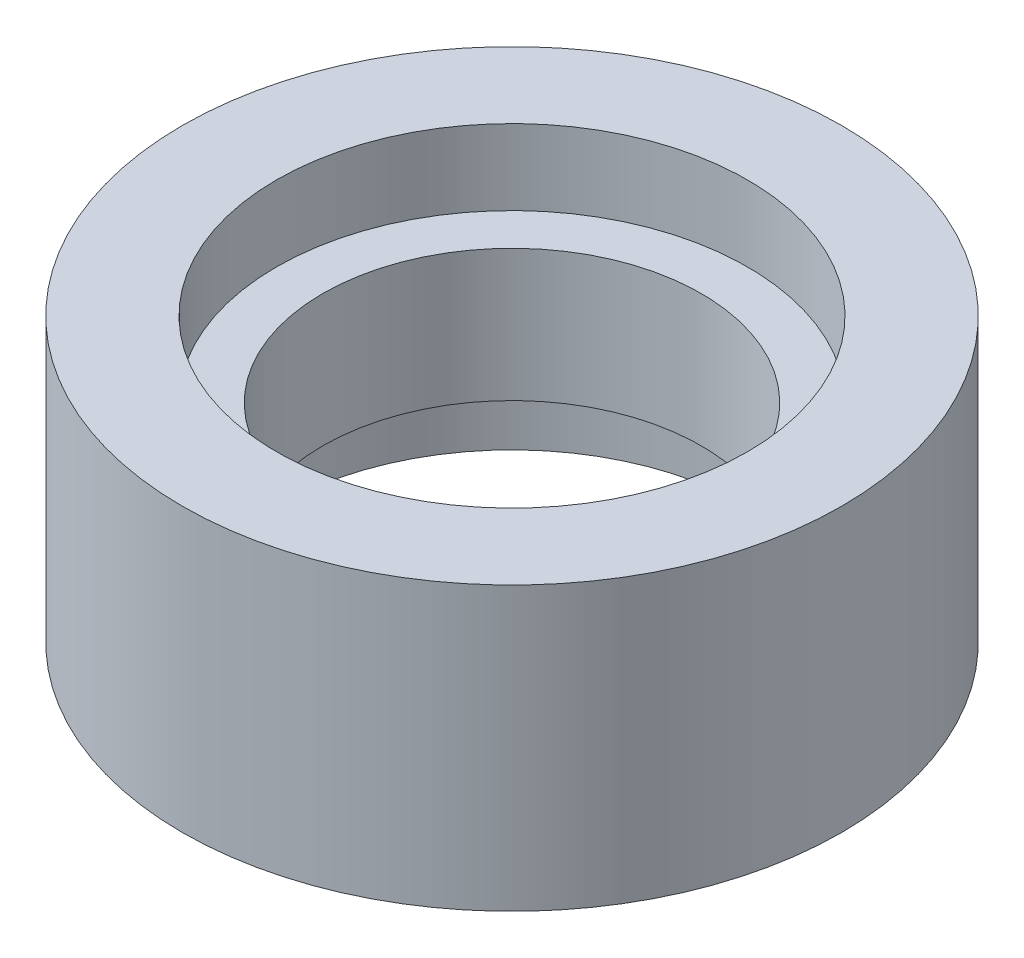
ISO-10303-21;
HEADER;
FILE_DESCRIPTION(('STEP AP214'),'2;1');
FILE_NAME('part.step','',(''),(''),'','','');
FILE_SCHEMA(('AUTOMOTIVE_DESIGN { 1 0 10303 214 1 1 1 1 }'));
ENDSEC;
DATA;
#1=APPLICATION_CONTEXT('core data for automotive mechanical design processes');
#2=APPLICATION_PROTOCOL_DEFINITION('international standard','automotive_design',2000,#1);
#3=PRODUCT_CONTEXT('',#1,'mechanical');
#4=PRODUCT('Part','Part','',(#3));
#5=PRODUCT_RELATED_PRODUCT_CATEGORY('part','',(#4));
#6=PRODUCT_DEFINITION_FORMATION('','',#4);
#7=PRODUCT_DEFINITION_CONTEXT('part definition',#1,'design');
#8=PRODUCT_DEFINITION('design','',#6,#7);
#9=PRODUCT_DEFINITION_SHAPE('','',#8);
#10=(LENGTH_UNIT() NAMED_UNIT(*) SI_UNIT(.MILLI.,.METRE.));
#11=(NAMED_UNIT(*) PLANE_ANGLE_UNIT() SI_UNIT($,.RADIAN.));
#12=(NAMED_UNIT(*) SI_UNIT($,.STERADIAN.) SOLID_ANGLE_UNIT());
#13=UNCERTAINTY_MEASURE_WITH_UNIT(LENGTH_MEASURE(1.E-05),#10,'distance_accuracy_value','');
#14=(GEOMETRIC_REPRESENTATION_CONTEXT(3) GLOBAL_UNCERTAINTY_ASSIGNED_CONTEXT((#13)) GLOBAL_UNIT_ASSIGNED_CONTEXT((#10,
#11,#12)) REPRESENTATION_CONTEXT('',''));
#15=CARTESIAN_POINT('',(0.,0.,0.));
#16=DIRECTION('',(0.,0.,1.));
#17=DIRECTION('',(1.,0.,0.));
#18=AXIS2_PLACEMENT_3D('',#15,#16,#17);
#19=CARTESIAN_POINT('',(0.,-1.5,0.));
#20=DIRECTION('',(0.,-1.,0.));
#21=DIRECTION('',(1.,0.,0.));
#22=AXIS2_PLACEMENT_3D('',#19,#20,#21);
#23=CYLINDRICAL_SURFACE('',#22,2.5);
#24=CARTESIAN_POINT('',(0.,-1.50000000000667,0.));
#25=DIRECTION('',(0.,-1.,0.));
#26=DIRECTION('',(0.,0.,-1.));
#27=AXIS2_PLACEMENT_3D('',#24,#25,#26);
#28=CIRCLE('',#27,2.5);
#29=CARTESIAN_POINT('',(-2.50000000000334,-1.50000000000667,0.));
#30=VERTEX_POINT('',#29);
#31=CARTESIAN_POINT('',(2.50000000000334,-1.50000000000667,0.));
#32=VERTEX_POINT('',#31);
#33=EDGE_CURVE('E11',#30,#32,#28,.T.);
#34=ORIENTED_EDGE('',*,*,#33,.T.);
#35=CARTESIAN_POINT('',(0.,-1.50000000001,0.));
#36=DIRECTION('',(0.,-1.,0.));
#37=DIRECTION('',(0.,0.,-1.));
#38=AXIS2_PLACEMENT_3D('',#35,#36,#37);
#39=CIRCLE('',#38,2.5);
#40=EDGE_CURVE('E20',#32,#30,#39,.T.);
#41=ORIENTED_EDGE('',*,*,#40,.T.);
#42=EDGE_LOOP('',(#34,#41));
#43=FACE_BOUND('',#42,.T.);
#44=CARTESIAN_POINT('',(0.,-0.700000000003333,0.));
#45=DIRECTION('',(0.,-1.,0.));
#46=DIRECTION('',(0.,0.,-1.));
#47=AXIS2_PLACEMENT_3D('',#44,#45,#46);
#48=CIRCLE('',#47,2.5);
#49=CARTESIAN_POINT('',(2.50000000000334,-0.700000000003333,0.));
#50=VERTEX_POINT('',#49);
#51=CARTESIAN_POINT('',(-2.50000000000334,-0.700000000003333,0.));
#52=VERTEX_POINT('',#51);
#53=EDGE_CURVE('E144',#50,#52,#48,.T.);
#54=ORIENTED_EDGE('',*,*,#53,.F.);
#55=CARTESIAN_POINT('',(0.,-0.7,0.));
#56=DIRECTION('',(0.,-1.,0.));
#57=DIRECTION('',(0.,0.,-1.));
#58=AXIS2_PLACEMENT_3D('',#55,#56,#57);
#59=CIRCLE('',#58,2.5);
#60=EDGE_CURVE('E139',#52,#50,#59,.T.);
#61=ORIENTED_EDGE('',*,*,#60,.F.);
#62=EDGE_LOOP('',(#54,#61));
#63=FACE_BOUND('',#62,.T.);
#64=ADVANCED_FACE('F17',(#43,#63),#23,.F.);
#65=CARTESIAN_POINT('',(0.,1.5,0.));
#66=DIRECTION('',(0.,1.,0.));
#67=DIRECTION('',(1.,0.,0.));
#68=AXIS2_PLACEMENT_3D('',#65,#66,#67);
#69=PLANE('',#68);
#70=CARTESIAN_POINT('',(0.,1.50000000001,0.));
#71=DIRECTION('',(0.,-1.,0.));
#72=DIRECTION('',(0.,0.,-1.));
#73=AXIS2_PLACEMENT_3D('',#70,#71,#72);
#74=CIRCLE('',#73,2.5);
#75=CARTESIAN_POINT('',(-2.50000000000334,1.50000000001,0.));
#76=VERTEX_POINT('',#75);
#77=CARTESIAN_POINT('',(2.50000000000334,1.50000000001,0.));
#78=VERTEX_POINT('',#77);
#79=EDGE_CURVE('E99',#76,#78,#74,.T.);
#80=ORIENTED_EDGE('',*,*,#79,.T.);
#81=CARTESIAN_POINT('',(0.,1.5,0.));
#82=DIRECTION('',(0.,-1.,0.));
#83=DIRECTION('',(0.,0.,-1.));
#84=AXIS2_PLACEMENT_3D('',#81,#82,#83);
#85=CIRCLE('',#84,2.5);
#86=EDGE_CURVE('E135',#78,#76,#85,.T.);
#87=ORIENTED_EDGE('',*,*,#86,.T.);
#88=EDGE_LOOP('',(#80,#87));
#89=FACE_BOUND('',#88,.T.);
#90=CARTESIAN_POINT('',(0.,1.50000000001,0.));
#91=DIRECTION('',(0.,-1.,0.));
#92=DIRECTION('',(0.,0.,-1.));
#93=AXIS2_PLACEMENT_3D('',#90,#91,#92);
#94=CIRCLE('',#93,3.5);
#95=CARTESIAN_POINT('',(3.50000000000334,1.50000000000334,0.));
#96=VERTEX_POINT('',#95);
#97=CARTESIAN_POINT('',(-3.50000000000334,1.50000000000334,0.));
#98=VERTEX_POINT('',#97);
#99=EDGE_CURVE('E148',#96,#98,#94,.T.);
#100=ORIENTED_EDGE('',*,*,#99,.F.);
#101=CARTESIAN_POINT('',(0.,1.50000000000334,0.));
#102=DIRECTION('',(0.,-1.,0.));
#103=DIRECTION('',(0.,0.,-1.));
#104=AXIS2_PLACEMENT_3D('',#101,#102,#103);
#105=CIRCLE('',#104,3.5);
#106=EDGE_CURVE('E151',#98,#96,#105,.T.);
#107=ORIENTED_EDGE('',*,*,#106,.F.);
#108=EDGE_LOOP('',(#100,#107));
#109=FACE_BOUND('',#108,.T.);
#110=ADVANCED_FACE('F166',(#89,#109),#69,.T.);
#111=CARTESIAN_POINT('',(0.,-1.5,0.));
#112=DIRECTION('',(0.,1.,0.));
#113=DIRECTION('',(1.,0.,0.));
#114=AXIS2_PLACEMENT_3D('',#111,#112,#113);
#115=PLANE('',#114);
#116=ORIENTED_EDGE('',*,*,#40,.F.);
#117=ORIENTED_EDGE('',*,*,#33,.F.);
#118=EDGE_LOOP('',(#116,#117));
#119=FACE_BOUND('',#118,.T.);
#120=CARTESIAN_POINT('',(0.,-1.50000000001,0.));
#121=DIRECTION('',(0.,1.,0.));
#122=DIRECTION('',(0.,0.,-1.));
#123=AXIS2_PLACEMENT_3D('',#120,#121,#122);
#124=CIRCLE('',#123,3.5);
#125=CARTESIAN_POINT('',(3.50000000000334,-1.50000000000667,0.));
#126=VERTEX_POINT('',#125);
#127=CARTESIAN_POINT('',(-3.50000000000334,-1.50000000000667,0.));
#128=VERTEX_POINT('',#127);
#129=EDGE_CURVE('E143',#126,#128,#124,.T.);
#130=ORIENTED_EDGE('',*,*,#129,.F.);
#131=CARTESIAN_POINT('',(0.,-1.50000000000667,0.));
#132=DIRECTION('',(0.,1.,0.));
#133=DIRECTION('',(0.,0.,-1.));
#134=AXIS2_PLACEMENT_3D('',#131,#132,#133);
#135=CIRCLE('',#134,3.5);
#136=EDGE_CURVE('E132',#128,#126,#135,.T.);
#137=ORIENTED_EDGE('',*,*,#136,.F.);
#138=EDGE_LOOP('',(#130,#137));
#139=FACE_BOUND('',#138,.T.);
#140=ADVANCED_FACE('F172',(#119,#139),#115,.F.);
#141=CARTESIAN_POINT('',(0.,0.7,0.));
#142=DIRECTION('',(0.,1.,0.));
#143=DIRECTION('',(1.,0.,0.));
#144=AXIS2_PLACEMENT_3D('',#141,#142,#143);
#145=PLANE('',#144);
#146=CARTESIAN_POINT('',(0.,0.700000000003333,0.));
#147=DIRECTION('',(0.,-1.,0.));
#148=DIRECTION('',(0.,0.,-1.));
#149=AXIS2_PLACEMENT_3D('',#146,#147,#148);
#150=CIRCLE('',#149,2.01);
#151=CARTESIAN_POINT('',(-2.01000000000334,0.700000000003333,0.));
#152=VERTEX_POINT('',#151);
#153=CARTESIAN_POINT('',(2.01000000000334,0.700000000003333,0.));
#154=VERTEX_POINT('',#153);
#155=EDGE_CURVE('E117',#152,#154,#150,.T.);
#156=ORIENTED_EDGE('',*,*,#155,.T.);
#157=CARTESIAN_POINT('',(0.,0.7,0.));
#158=DIRECTION('',(0.,-1.,0.));
#159=DIRECTION('',(0.,0.,-1.));
#160=AXIS2_PLACEMENT_3D('',#157,#158,#159);
#161=CIRCLE('',#160,2.01);
#162=EDGE_CURVE('E129',#154,#152,#161,.T.);
#163=ORIENTED_EDGE('',*,*,#162,.T.);
#164=EDGE_LOOP('',(#156,#163));
#165=FACE_BOUND('',#164,.T.);
#166=CARTESIAN_POINT('',(0.,0.700000000006667,0.));
#167=DIRECTION('',(0.,1.,0.));
#168=DIRECTION('',(0.,0.,-1.));
#169=AXIS2_PLACEMENT_3D('',#166,#167,#168);
#170=CIRCLE('',#169,2.5);
#171=CARTESIAN_POINT('',(2.50000000000334,0.700000000006667,0.));
#172=VERTEX_POINT('',#171);
#173=CARTESIAN_POINT('',(-2.50000000000334,0.700000000006667,0.));
#174=VERTEX_POINT('',#173);
#175=EDGE_CURVE('E136',#172,#174,#170,.T.);
#176=ORIENTED_EDGE('',*,*,#175,.T.);
#177=CARTESIAN_POINT('',(0.,0.7,0.));
#178=DIRECTION('',(0.,1.,0.));
#179=DIRECTION('',(0.,0.,-1.));
#180=AXIS2_PLACEMENT_3D('',#177,#178,#179);
#181=CIRCLE('',#180,2.5);
#182=EDGE_CURVE('E91',#174,#172,#181,.T.);
#183=ORIENTED_EDGE('',*,*,#182,.T.);
#184=EDGE_LOOP('',(#176,#183));
#185=FACE_BOUND('',#184,.T.);
#186=ADVANCED_FACE('F178',(#165,#185),#145,.T.);
#187=CARTESIAN_POINT('',(0.,-1.5,0.));
#188=DIRECTION('',(0.,-1.,0.));
#189=DIRECTION('',(1.,0.,0.));
#190=AXIS2_PLACEMENT_3D('',#187,#188,#189);
#191=CYLINDRICAL_SURFACE('',#190,2.5);
#192=ORIENTED_EDGE('',*,*,#86,.F.);
#193=ORIENTED_EDGE('',*,*,#79,.F.);
#194=EDGE_LOOP('',(#192,#193));
#195=FACE_BOUND('',#194,.T.);
#196=ORIENTED_EDGE('',*,*,#175,.F.);
#197=ORIENTED_EDGE('',*,*,#182,.F.);
#198=EDGE_LOOP('',(#196,#197));
#199=FACE_BOUND('',#198,.T.);
#200=ADVANCED_FACE('F189',(#195,#199),#191,.F.);
#201=CARTESIAN_POINT('',(0.,-0.7,0.));
#202=DIRECTION('',(0.,1.,0.));
#203=DIRECTION('',(1.,0.,0.));
#204=AXIS2_PLACEMENT_3D('',#201,#202,#203);
#205=PLANE('',#204);
#206=CARTESIAN_POINT('',(0.,-0.700000000006667,0.));
#207=DIRECTION('',(0.,-1.,0.));
#208=DIRECTION('',(0.,0.,-1.));
#209=AXIS2_PLACEMENT_3D('',#206,#207,#208);
#210=CIRCLE('',#209,2.01);
#211=CARTESIAN_POINT('',(2.01000000000334,-0.700000000006667,0.));
#212=VERTEX_POINT('',#211);
#213=CARTESIAN_POINT('',(-2.01000000000334,-0.700000000006667,0.));
#214=VERTEX_POINT('',#213);
#215=EDGE_CURVE('E115',#212,#214,#210,.T.);
#216=ORIENTED_EDGE('',*,*,#215,.F.);
#217=CARTESIAN_POINT('',(0.,-0.70000000001,0.));
#218=DIRECTION('',(0.,-1.,0.));
#219=DIRECTION('',(0.,0.,-1.));
#220=AXIS2_PLACEMENT_3D('',#217,#218,#219);
#221=CIRCLE('',#220,2.01);
#222=EDGE_CURVE('E109',#214,#212,#221,.T.);
#223=ORIENTED_EDGE('',*,*,#222,.F.);
#224=EDGE_LOOP('',(#216,#223));
#225=FACE_BOUND('',#224,.T.);
#226=ORIENTED_EDGE('',*,*,#53,.T.);
#227=ORIENTED_EDGE('',*,*,#60,.T.);
#228=EDGE_LOOP('',(#226,#227));
#229=FACE_BOUND('',#228,.T.);
#230=ADVANCED_FACE('F113',(#225,#229),#205,.F.);
#231=CARTESIAN_POINT('',(0.,-1.5,0.));
#232=DIRECTION('',(0.,-1.,0.));
#233=DIRECTION('',(1.,0.,0.));
#234=AXIS2_PLACEMENT_3D('',#231,#232,#233);
#235=CYLINDRICAL_SURFACE('',#234,3.5);
#236=ORIENTED_EDGE('',*,*,#106,.T.);
#237=ORIENTED_EDGE('',*,*,#99,.T.);
#238=EDGE_LOOP('',(#236,#237));
#239=FACE_BOUND('',#238,.T.);
#240=ORIENTED_EDGE('',*,*,#136,.T.);
#241=ORIENTED_EDGE('',*,*,#129,.T.);
#242=EDGE_LOOP('',(#240,#241));
#243=FACE_BOUND('',#242,.T.);
#244=ADVANCED_FACE('F183',(#239,#243),#235,.T.);
#245=CARTESIAN_POINT('',(0.,-0.7,0.));
#246=DIRECTION('',(0.,-1.,0.));
#247=DIRECTION('',(1.,0.,0.));
#248=AXIS2_PLACEMENT_3D('',#245,#246,#247);
#249=CYLINDRICAL_SURFACE('',#248,2.01);
#250=ORIENTED_EDGE('',*,*,#155,.F.);
#251=ORIENTED_EDGE('',*,*,#162,.F.);
#252=EDGE_LOOP('',(#250,#251));
#253=FACE_BOUND('',#252,.T.);
#254=ORIENTED_EDGE('',*,*,#215,.T.);
#255=ORIENTED_EDGE('',*,*,#222,.T.);
#256=EDGE_LOOP('',(#254,#255));
#257=FACE_BOUND('',#256,.T.);
#258=ADVANCED_FACE('F119',(#253,#257),#249,.F.);
#259=CLOSED_SHELL('',(#64,#110,#140,#186,#200,#230,#244,#258));
#260=MANIFOLD_SOLID_BREP('B1',#259);
#261=ADVANCED_BREP_SHAPE_REPRESENTATION('',(#18,#260),#14);
#262=SHAPE_DEFINITION_REPRESENTATION(#9,#261);
ENDSEC;
END-ISO-10303-21;
